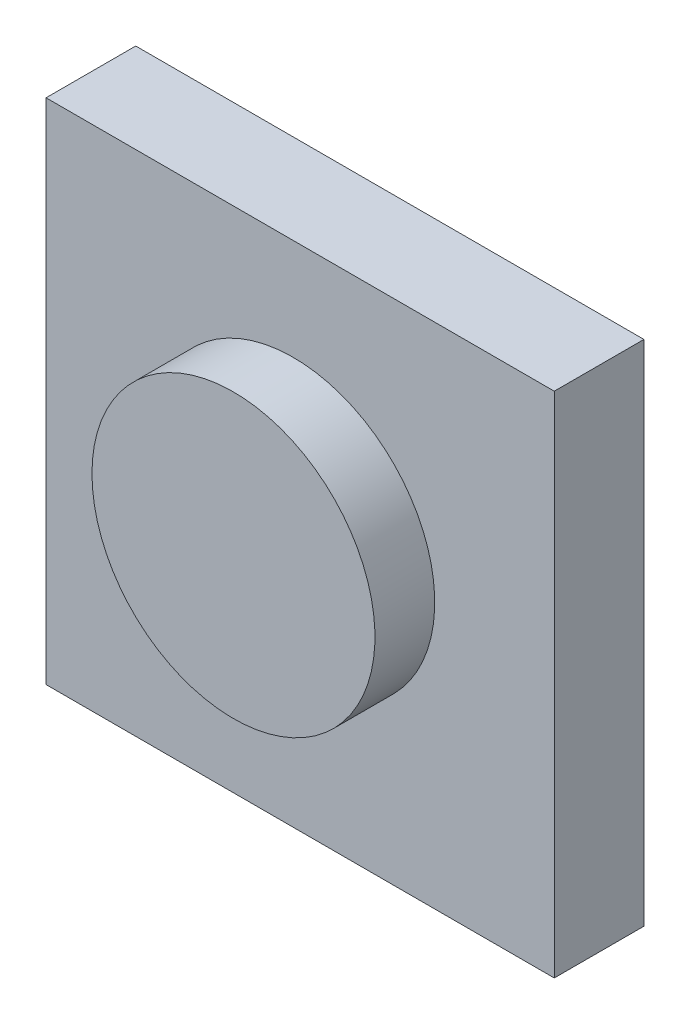
ISO-10303-21;
HEADER;
FILE_DESCRIPTION(('STEP AP214'),'2;1');
FILE_NAME('part.step','',(''),(''),'','','');
FILE_SCHEMA(('AUTOMOTIVE_DESIGN { 1 0 10303 214 1 1 1 1 }'));
ENDSEC;
DATA;
#1=APPLICATION_CONTEXT('core data for automotive mechanical design processes');
#2=APPLICATION_PROTOCOL_DEFINITION('international standard','automotive_design',2000,#1);
#3=PRODUCT_CONTEXT('',#1,'mechanical');
#4=PRODUCT('Part','Part','',(#3));
#5=PRODUCT_RELATED_PRODUCT_CATEGORY('part','',(#4));
#6=PRODUCT_DEFINITION_FORMATION('','',#4);
#7=PRODUCT_DEFINITION_CONTEXT('part definition',#1,'design');
#8=PRODUCT_DEFINITION('design','',#6,#7);
#9=PRODUCT_DEFINITION_SHAPE('','',#8);
#10=(LENGTH_UNIT() NAMED_UNIT(*) SI_UNIT(.MILLI.,.METRE.));
#11=(NAMED_UNIT(*) PLANE_ANGLE_UNIT() SI_UNIT($,.RADIAN.));
#12=(NAMED_UNIT(*) SI_UNIT($,.STERADIAN.) SOLID_ANGLE_UNIT());
#13=UNCERTAINTY_MEASURE_WITH_UNIT(LENGTH_MEASURE(1.E-05),#10,'distance_accuracy_value','');
#14=(GEOMETRIC_REPRESENTATION_CONTEXT(3) GLOBAL_UNCERTAINTY_ASSIGNED_CONTEXT((#13)) GLOBAL_UNIT_ASSIGNED_CONTEXT((#10,
#11,#12)) REPRESENTATION_CONTEXT('',''));
#15=CARTESIAN_POINT('',(0.,0.,0.));
#16=DIRECTION('',(0.,0.,1.));
#17=DIRECTION('',(1.,0.,0.));
#18=AXIS2_PLACEMENT_3D('',#15,#16,#17);
#19=CARTESIAN_POINT('',(11.2435343973243,21.7048598216375,1.5));
#20=DIRECTION('',(0.,0.,1.));
#21=DIRECTION('',(1.,0.,0.));
#22=AXIS2_PLACEMENT_3D('',#19,#20,#21);
#23=PLANE('',#22);
#24=CARTESIAN_POINT('',(11.7268410327987,22.1881664571119,1.5));
#25=DIRECTION('',(0.,0.,-1.));
#26=DIRECTION('',(-1.,0.,0.));
#27=AXIS2_PLACEMENT_3D('',#24,#25,#26);
#28=CIRCLE('',#27,0.473306635474395);
#29=CARTESIAN_POINT('',(11.2535343973243,22.1881664571119,1.5));
#30=VERTEX_POINT('',#29);
#31=EDGE_CURVE('E20',#30,#30,#28,.T.);
#32=ORIENTED_EDGE('',*,*,#31,.F.);
#33=EDGE_LOOP('',(#32));
#34=FACE_BOUND('',#33,.T.);
#35=ADVANCED_FACE('F16',(#34),#23,.T.);
#36=CARTESIAN_POINT('',(11.7268410327987,22.1881664571119,1.5));
#37=DIRECTION('',(0.,0.,-1.));
#38=DIRECTION('',(-1.,0.,0.));
#39=AXIS2_PLACEMENT_3D('',#36,#37,#38);
#40=CYLINDRICAL_SURFACE('',#39,0.473306635474395);
#41=CARTESIAN_POINT('',(11.7268410327987,22.1881664571119,1.3));
#42=DIRECTION('',(0.,0.,-1.));
#43=DIRECTION('',(-1.,0.,0.));
#44=AXIS2_PLACEMENT_3D('',#41,#42,#43);
#45=CIRCLE('',#44,0.473306635474395);
#46=CARTESIAN_POINT('',(11.2535343973243,22.1881664571119,1.3));
#47=VERTEX_POINT('',#46);
#48=EDGE_CURVE('E69',#47,#47,#45,.T.);
#49=ORIENTED_EDGE('',*,*,#48,.F.);
#50=EDGE_LOOP('',(#49));
#51=FACE_BOUND('',#50,.T.);
#52=ORIENTED_EDGE('',*,*,#31,.T.);
#53=EDGE_LOOP('',(#52));
#54=FACE_BOUND('',#53,.T.);
#55=ADVANCED_FACE('F88',(#51,#54),#40,.T.);
#56=CARTESIAN_POINT('',(10.889999756366,21.2899995239079,1.3));
#57=DIRECTION('',(0.,0.,1.));
#58=DIRECTION('',(1.,0.,0.));
#59=AXIS2_PLACEMENT_3D('',#56,#57,#58);
#60=PLANE('',#59);
#61=ORIENTED_EDGE('',*,*,#48,.T.);
#62=EDGE_LOOP('',(#61));
#63=FACE_BOUND('',#62,.T.);
#64=DIRECTION('',(1.,0.,0.));
#65=VECTOR('',#64,1.);
#66=CARTESIAN_POINT('',(11.7499997373671,22.9999994859099,1.3));
#67=LINE('',#66,#65);
#68=CARTESIAN_POINT('',(10.899999756366,22.9999994859099,1.3));
#69=VERTEX_POINT('',#68);
#70=CARTESIAN_POINT('',(12.5999997183681,22.9999994859099,1.3));
#71=VERTEX_POINT('',#70);
#72=EDGE_CURVE('E55',#69,#71,#67,.T.);
#73=ORIENTED_EDGE('',*,*,#72,.F.);
#74=DIRECTION('',(0.,1.,0.));
#75=VECTOR('',#74,1.);
#76=CARTESIAN_POINT('',(10.899999756366,22.1499995049089,1.3));
#77=LINE('',#76,#75);
#78=CARTESIAN_POINT('',(10.899999756366,21.2999995239079,1.3));
#79=VERTEX_POINT('',#78);
#80=EDGE_CURVE('E60',#79,#69,#77,.T.);
#81=ORIENTED_EDGE('',*,*,#80,.F.);
#82=DIRECTION('',(-1.,0.,0.));
#83=VECTOR('',#82,1.);
#84=CARTESIAN_POINT('',(11.7499997373671,21.2999995239079,1.3));
#85=LINE('',#84,#83);
#86=CARTESIAN_POINT('',(12.5999997183681,21.2999995239079,1.3));
#87=VERTEX_POINT('',#86);
#88=EDGE_CURVE('E113',#87,#79,#85,.T.);
#89=ORIENTED_EDGE('',*,*,#88,.F.);
#90=DIRECTION('',(0.,-1.,0.));
#91=VECTOR('',#90,1.);
#92=CARTESIAN_POINT('',(12.5999997183681,22.1499995049089,1.3));
#93=LINE('',#92,#91);
#94=EDGE_CURVE('E72',#71,#87,#93,.T.);
#95=ORIENTED_EDGE('',*,*,#94,.F.);
#96=EDGE_LOOP('',(#73,#81,#89,#95));
#97=FACE_BOUND('',#96,.T.);
#98=ADVANCED_FACE('F71',(#63,#97),#60,.T.);
#99=CARTESIAN_POINT('',(10.899999756366,23.0099994859099,0.99));
#100=DIRECTION('',(-1.,0.,0.));
#101=DIRECTION('',(0.,-1.,0.));
#102=AXIS2_PLACEMENT_3D('',#99,#100,#101);
#103=PLANE('',#102);
#104=ORIENTED_EDGE('',*,*,#80,.T.);
#105=DIRECTION('',(0.,0.,1.));
#106=VECTOR('',#105,1.);
#107=CARTESIAN_POINT('',(10.899999756366,22.9999994859099,1.15));
#108=LINE('',#107,#106);
#109=CARTESIAN_POINT('',(10.899999756366,22.9999994859099,1.));
#110=VERTEX_POINT('',#109);
#111=EDGE_CURVE('E62',#110,#69,#108,.T.);
#112=ORIENTED_EDGE('',*,*,#111,.F.);
#113=DIRECTION('',(0.,1.,0.));
#114=VECTOR('',#113,1.);
#115=CARTESIAN_POINT('',(10.899999756366,22.1499995049089,1.));
#116=LINE('',#115,#114);
#117=CARTESIAN_POINT('',(10.899999756366,21.2999995239079,1.));
#118=VERTEX_POINT('',#117);
#119=EDGE_CURVE('E108',#118,#110,#116,.T.);
#120=ORIENTED_EDGE('',*,*,#119,.F.);
#121=DIRECTION('',(0.,0.,-1.));
#122=VECTOR('',#121,1.);
#123=CARTESIAN_POINT('',(10.899999756366,21.2999995239079,1.15));
#124=LINE('',#123,#122);
#125=EDGE_CURVE('E65',#79,#118,#124,.T.);
#126=ORIENTED_EDGE('',*,*,#125,.F.);
#127=EDGE_LOOP('',(#104,#112,#120,#126));
#128=FACE_BOUND('',#127,.T.);
#129=ADVANCED_FACE('F61',(#128),#103,.T.);
#130=CARTESIAN_POINT('',(12.6099997183681,22.9999994859099,0.99));
#131=DIRECTION('',(0.,1.,0.));
#132=DIRECTION('',(-1.,0.,0.));
#133=AXIS2_PLACEMENT_3D('',#130,#131,#132);
#134=PLANE('',#133);
#135=ORIENTED_EDGE('',*,*,#72,.T.);
#136=DIRECTION('',(0.,0.,1.));
#137=VECTOR('',#136,1.);
#138=CARTESIAN_POINT('',(12.5999997183681,22.9999994859099,1.15));
#139=LINE('',#138,#137);
#140=CARTESIAN_POINT('',(12.5999997183681,22.9999994859099,1.));
#141=VERTEX_POINT('',#140);
#142=EDGE_CURVE('E74',#141,#71,#139,.T.);
#143=ORIENTED_EDGE('',*,*,#142,.F.);
#144=DIRECTION('',(1.,0.,0.));
#145=VECTOR('',#144,1.);
#146=CARTESIAN_POINT('',(11.7499997373671,22.9999994859099,1.));
#147=LINE('',#146,#145);
#148=EDGE_CURVE('E78',#110,#141,#147,.T.);
#149=ORIENTED_EDGE('',*,*,#148,.F.);
#150=ORIENTED_EDGE('',*,*,#111,.T.);
#151=EDGE_LOOP('',(#135,#143,#149,#150));
#152=FACE_BOUND('',#151,.T.);
#153=ADVANCED_FACE('F76',(#152),#134,.T.);
#154=CARTESIAN_POINT('',(12.5999997183681,21.2899995239079,0.99));
#155=DIRECTION('',(1.,0.,0.));
#156=DIRECTION('',(0.,1.,0.));
#157=AXIS2_PLACEMENT_3D('',#154,#155,#156);
#158=PLANE('',#157);
#159=ORIENTED_EDGE('',*,*,#94,.T.);
#160=DIRECTION('',(0.,0.,1.));
#161=VECTOR('',#160,1.);
#162=CARTESIAN_POINT('',(12.5999997183681,21.2999995239079,1.15));
#163=LINE('',#162,#161);
#164=CARTESIAN_POINT('',(12.5999997183681,21.2999995239079,1.));
#165=VERTEX_POINT('',#164);
#166=EDGE_CURVE('E35',#165,#87,#163,.T.);
#167=ORIENTED_EDGE('',*,*,#166,.F.);
#168=DIRECTION('',(0.,-1.,0.));
#169=VECTOR('',#168,1.);
#170=CARTESIAN_POINT('',(12.5999997183681,22.1499995049089,1.));
#171=LINE('',#170,#169);
#172=EDGE_CURVE('E26',#141,#165,#171,.T.);
#173=ORIENTED_EDGE('',*,*,#172,.F.);
#174=ORIENTED_EDGE('',*,*,#142,.T.);
#175=EDGE_LOOP('',(#159,#167,#173,#174));
#176=FACE_BOUND('',#175,.T.);
#177=ADVANCED_FACE('F104',(#176),#158,.T.);
#178=CARTESIAN_POINT('',(10.889999756366,21.2999995239079,0.99));
#179=DIRECTION('',(0.,-1.,0.));
#180=DIRECTION('',(1.,0.,0.));
#181=AXIS2_PLACEMENT_3D('',#178,#179,#180);
#182=PLANE('',#181);
#183=ORIENTED_EDGE('',*,*,#88,.T.);
#184=ORIENTED_EDGE('',*,*,#125,.T.);
#185=DIRECTION('',(-1.,0.,0.));
#186=VECTOR('',#185,1.);
#187=CARTESIAN_POINT('',(11.7499997373671,21.2999995239079,1.));
#188=LINE('',#187,#186);
#189=EDGE_CURVE('E11',#165,#118,#188,.T.);
#190=ORIENTED_EDGE('',*,*,#189,.F.);
#191=ORIENTED_EDGE('',*,*,#166,.T.);
#192=EDGE_LOOP('',(#183,#184,#190,#191));
#193=FACE_BOUND('',#192,.T.);
#194=ADVANCED_FACE('F99',(#193),#182,.T.);
#195=CARTESIAN_POINT('',(12.6099997183681,21.2899995239079,1.));
#196=DIRECTION('',(0.,0.,-1.));
#197=DIRECTION('',(-1.,0.,0.));
#198=AXIS2_PLACEMENT_3D('',#195,#196,#197);
#199=PLANE('',#198);
#200=ORIENTED_EDGE('',*,*,#172,.T.);
#201=ORIENTED_EDGE('',*,*,#189,.T.);
#202=ORIENTED_EDGE('',*,*,#119,.T.);
#203=ORIENTED_EDGE('',*,*,#148,.T.);
#204=EDGE_LOOP('',(#200,#201,#202,#203));
#205=FACE_BOUND('',#204,.T.);
#206=ADVANCED_FACE('F18',(#205),#199,.T.);
#207=CLOSED_SHELL('',(#35,#55,#98,#129,#153,#177,#194,#206));
#208=MANIFOLD_SOLID_BREP('B1',#207);
#209=ADVANCED_BREP_SHAPE_REPRESENTATION('',(#18,#208),#14);
#210=SHAPE_DEFINITION_REPRESENTATION(#9,#209);
ENDSEC;
END-ISO-10303-21;
